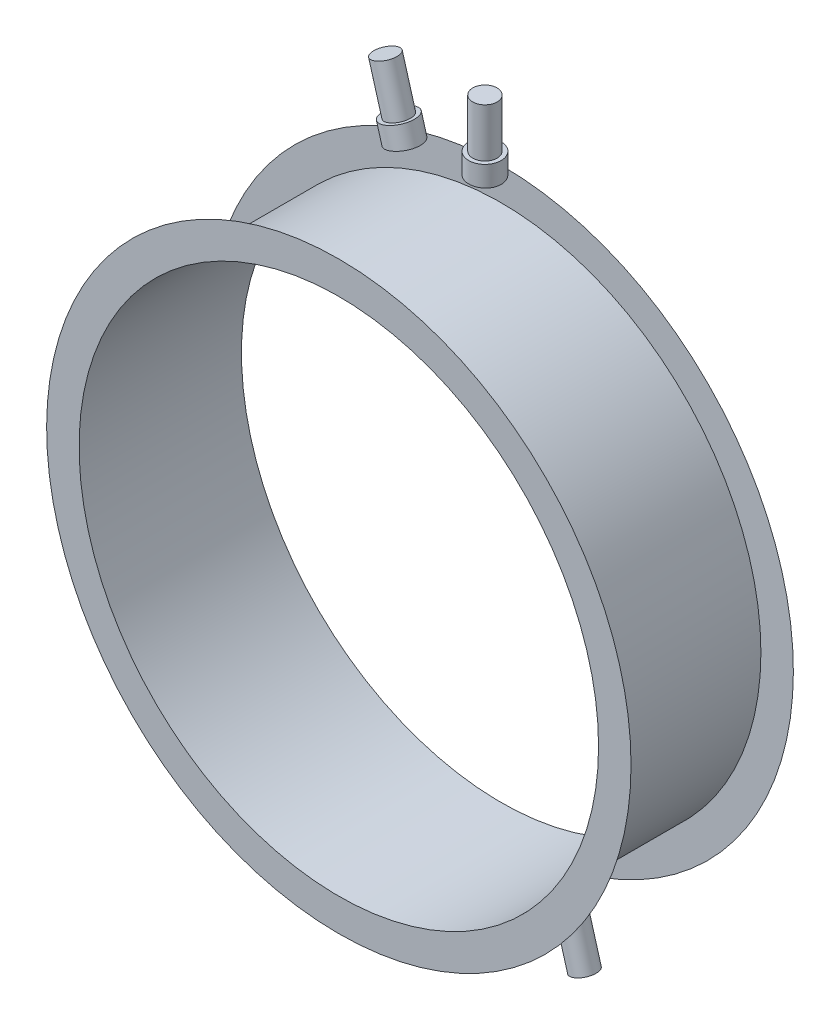
ISO-10303-21;
HEADER;
FILE_DESCRIPTION(('STEP AP214'),'2;1');
FILE_NAME('part.step','',(''),(''),'','','');
FILE_SCHEMA(('AUTOMOTIVE_DESIGN { 1 0 10303 214 1 1 1 1 }'));
ENDSEC;
DATA;
#1=APPLICATION_CONTEXT('core data for automotive mechanical design processes');
#2=APPLICATION_PROTOCOL_DEFINITION('international standard','automotive_design',2000,#1);
#3=PRODUCT_CONTEXT('',#1,'mechanical');
#4=PRODUCT('Part','Part','',(#3));
#5=PRODUCT_RELATED_PRODUCT_CATEGORY('part','',(#4));
#6=PRODUCT_DEFINITION_FORMATION('','',#4);
#7=PRODUCT_DEFINITION_CONTEXT('part definition',#1,'design');
#8=PRODUCT_DEFINITION('design','',#6,#7);
#9=PRODUCT_DEFINITION_SHAPE('','',#8);
#10=(LENGTH_UNIT() NAMED_UNIT(*) SI_UNIT(.MILLI.,.METRE.));
#11=(NAMED_UNIT(*) PLANE_ANGLE_UNIT() SI_UNIT($,.RADIAN.));
#12=(NAMED_UNIT(*) SI_UNIT($,.STERADIAN.) SOLID_ANGLE_UNIT());
#13=UNCERTAINTY_MEASURE_WITH_UNIT(LENGTH_MEASURE(1.E-05),#10,'distance_accuracy_value','');
#14=(GEOMETRIC_REPRESENTATION_CONTEXT(3) GLOBAL_UNCERTAINTY_ASSIGNED_CONTEXT((#13)) GLOBAL_UNIT_ASSIGNED_CONTEXT((#10,
#11,#12)) REPRESENTATION_CONTEXT('',''));
#15=CARTESIAN_POINT('',(0.,0.,0.));
#16=DIRECTION('',(0.,0.,1.));
#17=DIRECTION('',(1.,0.,0.));
#18=AXIS2_PLACEMENT_3D('',#15,#16,#17);
#19=CARTESIAN_POINT('',(0.,0.,10.));
#20=DIRECTION('',(0.,0.,1.));
#21=DIRECTION('',(1.,0.,0.));
#22=AXIS2_PLACEMENT_3D('',#19,#20,#21);
#23=PLANE('',#22);
#24=CARTESIAN_POINT('',(0.,0.,10.));
#25=DIRECTION('',(0.,0.,1.));
#26=DIRECTION('',(1.,0.,0.));
#27=AXIS2_PLACEMENT_3D('',#24,#25,#26);
#28=CIRCLE('',#27,36.);
#29=CARTESIAN_POINT('',(36.,0.,10.));
#30=VERTEX_POINT('',#29);
#31=EDGE_CURVE('E11',#30,#30,#28,.T.);
#32=ORIENTED_EDGE('',*,*,#31,.T.);
#33=EDGE_LOOP('',(#32));
#34=FACE_BOUND('',#33,.T.);
#35=CARTESIAN_POINT('',(0.,0.,10.));
#36=DIRECTION('',(0.,0.,1.));
#37=DIRECTION('',(1.,0.,0.));
#38=AXIS2_PLACEMENT_3D('',#35,#36,#37);
#39=CIRCLE('',#38,32.);
#40=CARTESIAN_POINT('',(32.,0.,10.));
#41=VERTEX_POINT('',#40);
#42=EDGE_CURVE('E76',#41,#41,#39,.T.);
#43=ORIENTED_EDGE('',*,*,#42,.F.);
#44=EDGE_LOOP('',(#43));
#45=FACE_BOUND('',#44,.T.);
#46=ADVANCED_FACE('F39',(#34,#45),#23,.T.);
#47=CARTESIAN_POINT('',(0.,0.,-10.));
#48=DIRECTION('',(0.,0.,1.));
#49=DIRECTION('',(1.,0.,0.));
#50=AXIS2_PLACEMENT_3D('',#47,#48,#49);
#51=PLANE('',#50);
#52=CARTESIAN_POINT('',(0.,0.,-10.));
#53=DIRECTION('',(0.,0.,1.));
#54=DIRECTION('',(1.,0.,0.));
#55=AXIS2_PLACEMENT_3D('',#52,#53,#54);
#56=CIRCLE('',#55,36.);
#57=CARTESIAN_POINT('',(9.92294480941199,-34.6054210537795,-9.99999999999999));
#58=VERTEX_POINT('',#57);
#59=CARTESIAN_POINT('',(0.,36.,-9.99999999999999));
#60=VERTEX_POINT('',#59);
#61=EDGE_CURVE('E67',#58,#60,#56,.T.);
#62=ORIENTED_EDGE('',*,*,#61,.F.);
#63=CARTESIAN_POINT('',(0.,-36.,-9.99999999999999));
#64=VERTEX_POINT('',#63);
#65=EDGE_CURVE('E75',#64,#58,#56,.T.);
#66=ORIENTED_EDGE('',*,*,#65,.F.);
#67=CARTESIAN_POINT('',(-9.92294480941199,34.6054210537795,-9.99999999999999));
#68=VERTEX_POINT('',#67);
#69=EDGE_CURVE('E331',#68,#64,#56,.T.);
#70=ORIENTED_EDGE('',*,*,#69,.F.);
#71=EDGE_CURVE('E44',#60,#68,#56,.T.);
#72=ORIENTED_EDGE('',*,*,#71,.F.);
#73=EDGE_LOOP('',(#62,#66,#70,#72));
#74=FACE_BOUND('',#73,.T.);
#75=CARTESIAN_POINT('',(0.,0.,-10.));
#76=DIRECTION('',(0.,0.,1.));
#77=DIRECTION('',(1.,0.,0.));
#78=AXIS2_PLACEMENT_3D('',#75,#76,#77);
#79=CIRCLE('',#78,32.);
#80=CARTESIAN_POINT('',(32.,0.,-10.));
#81=VERTEX_POINT('',#80);
#82=EDGE_CURVE('E79',#81,#81,#79,.T.);
#83=ORIENTED_EDGE('',*,*,#82,.T.);
#84=EDGE_LOOP('',(#83));
#85=FACE_BOUND('',#84,.T.);
#86=ADVANCED_FACE('F105',(#74,#85),#51,.F.);
#87=CARTESIAN_POINT('',(0.,0.,10.));
#88=DIRECTION('',(0.,0.,-1.));
#89=DIRECTION('',(-1.,0.,0.));
#90=AXIS2_PLACEMENT_3D('',#87,#88,#89);
#91=CYLINDRICAL_SURFACE('',#90,36.);
#92=ORIENTED_EDGE('',*,*,#31,.F.);
#93=EDGE_LOOP('',(#92));
#94=FACE_BOUND('',#93,.T.);
#95=ORIENTED_EDGE('',*,*,#65,.T.);
#96=CARTESIAN_POINT('',(9.92294480941199,-34.6054210537795,-6.));
#97=CARTESIAN_POINT('',(10.0308442928042,-34.5744806036036,-6.00000494774937));
#98=CARTESIAN_POINT('',(10.1386740463086,-34.5430097046028,-6.00948145201388));
#99=CARTESIAN_POINT('',(10.3510772403165,-34.47995815608,-6.04715003511845));
#100=CARTESIAN_POINT('',(10.4556467129515,-34.4483774211239,-6.07536405347581));
#101=CARTESIAN_POINT('',(10.6584613513229,-34.3861665277643,-6.14969629591076));
#102=CARTESIAN_POINT('',(10.7567097567415,-34.3555358866544,-6.19580526184132));
#103=CARTESIAN_POINT('',(10.9441811196667,-34.2962764358472,-6.30460397861821));
#104=CARTESIAN_POINT('',(11.0334061745006,-34.2676471614456,-6.36728986413462));
#105=CARTESIAN_POINT('',(11.2005004547353,-34.2133969021549,-6.50754702106661));
#106=CARTESIAN_POINT('',(11.2783574741308,-34.1877791564493,-6.5851340881755));
#107=CARTESIAN_POINT('',(11.4204761546084,-34.140567464197,-6.75295914014094));
#108=CARTESIAN_POINT('',(11.4847372550701,-34.1189736835807,-6.84319764641785));
#109=CARTESIAN_POINT('',(11.5979457182922,-34.0806578899849,-7.03383293604228));
#110=CARTESIAN_POINT('',(11.6468833783674,-34.0639389641853,-7.13423610255261));
#111=CARTESIAN_POINT('',(11.7280540488071,-34.0360779248755,-7.34230578984241));
#112=CARTESIAN_POINT('',(11.7602872079493,-34.0249357616961,-7.4499722459222));
#113=CARTESIAN_POINT('',(11.807144117694,-34.0087043048033,-7.66939330429886));
#114=CARTESIAN_POINT('',(11.8217861869566,-34.003608714498,-7.78114352870289));
#115=CARTESIAN_POINT('',(11.8331218960797,-33.9996656449351,-8.00565929847598));
#116=CARTESIAN_POINT('',(11.8298157032699,-34.0008181074277,-8.11842483436963));
#117=CARTESIAN_POINT('',(11.8053593729656,-34.0093171602239,-8.34163860572427));
#118=CARTESIAN_POINT('',(11.7842290224478,-34.0166568819136,-8.45208927168562));
#119=CARTESIAN_POINT('',(11.7247262461332,-34.037211650285,-8.66767126323091));
#120=CARTESIAN_POINT('',(11.6863537347541,-34.0504267261294,-8.77280256240897));
#121=CARTESIAN_POINT('',(11.5933839381233,-34.0821925826076,-8.97482883170864));
#122=CARTESIAN_POINT('',(11.5387776074371,-34.1007463377516,-9.07171917118094));
#123=CARTESIAN_POINT('',(11.4148321000376,-34.1424350169363,-9.25446252398772));
#124=CARTESIAN_POINT('',(11.3454927936229,-34.1655699813074,-9.34031544014386));
#125=CARTESIAN_POINT('',(11.1938650179452,-34.2155483878182,-9.49866860225165));
#126=CARTESIAN_POINT('',(11.1115591410339,-34.242396809281,-9.57115060958609));
#127=CARTESIAN_POINT('',(10.9363220122398,-34.2987655434049,-9.70056385615663));
#128=CARTESIAN_POINT('',(10.8433907573213,-34.3282858568293,-9.7574950909497));
#129=CARTESIAN_POINT('',(10.6494663075781,-34.3889397506332,-9.85418906154846));
#130=CARTESIAN_POINT('',(10.5484728034218,-34.4200733928967,-9.89395113823401));
#131=CARTESIAN_POINT('',(10.341246653076,-34.4828991194009,-9.95516606300324));
#132=CARTESIAN_POINT('',(10.2350140552739,-34.5145911984824,-9.97661908015255));
#133=CARTESIAN_POINT('',(10.0204496538186,-34.5774936590455,-10.0005843842558));
#134=CARTESIAN_POINT('',(9.9121208388112,-34.6087046265902,-10.0031218940885));
#135=CARTESIAN_POINT('',(9.69630299733218,-34.6697892561597,-9.98925000975776));
#136=CARTESIAN_POINT('',(9.5888139674215,-34.6996629236633,-9.97284069322512));
#137=CARTESIAN_POINT('',(9.37781641334908,-34.7572800841819,-9.92156183606236));
#138=CARTESIAN_POINT('',(9.27430544421754,-34.7850248964195,-9.88670383535764));
#139=CARTESIAN_POINT('',(9.07416506366588,-34.837770436893,-9.79952880805727));
#140=CARTESIAN_POINT('',(8.9775357011999,-34.8627711456085,-9.74721165727631));
#141=CARTESIAN_POINT('',(8.79384962330079,-34.9095576365602,-9.62653899778058));
#142=CARTESIAN_POINT('',(8.70680312668272,-34.931339995171,-9.55816660708031));
#143=CARTESIAN_POINT('',(8.54492915756452,-34.9712903788076,-9.40734893524557));
#144=CARTESIAN_POINT('',(8.47010178089174,-34.9894583754883,-9.32490354375522));
#145=CARTESIAN_POINT('',(8.33478065844946,-35.0219401695929,-9.14817155362391));
#146=CARTESIAN_POINT('',(8.27430269274154,-35.0362497262234,-9.05387209172408));
#147=CARTESIAN_POINT('',(8.16957349417223,-35.0608182293198,-8.85617362336364));
#148=CARTESIAN_POINT('',(8.12532217835486,-35.0710771964936,-8.75277466342602));
#149=CARTESIAN_POINT('',(8.05438458521675,-35.0874368202269,-8.53987248743101));
#150=CARTESIAN_POINT('',(8.02768821559195,-35.0935398660892,-8.43037281800779));
#151=CARTESIAN_POINT('',(7.99262010167114,-35.1015434477758,-8.20832804070095));
#152=CARTESIAN_POINT('',(7.98424822094657,-35.1034440148881,-8.09578295549722));
#153=CARTESIAN_POINT('',(7.98607922919169,-35.1030274897863,-7.87100462753937));
#154=CARTESIAN_POINT('',(7.99625702285902,-35.1007160958096,-7.75877116889688));
#155=CARTESIAN_POINT('',(8.03483294920206,-35.0919056982572,-7.53764994837896));
#156=CARTESIAN_POINT('',(8.06323111594376,-35.0854066868521,-7.42876219275928));
#157=CARTESIAN_POINT('',(8.1373995606435,-35.068278645287,-7.2174186203501));
#158=CARTESIAN_POINT('',(8.18316987334507,-35.0576496068671,-7.11496281642471));
#159=CARTESIAN_POINT('',(8.29072378116876,-35.0323698529778,-6.91938164346649));
#160=CARTESIAN_POINT('',(8.35250691694994,-35.0177192528695,-6.82625600689642));
#161=CARTESIAN_POINT('',(8.49035543944084,-34.9845520503984,-6.65184929180712));
#162=CARTESIAN_POINT('',(8.56643845372571,-34.9660306733093,-6.57058305448308));
#163=CARTESIAN_POINT('',(8.730634883088,-34.9253940794714,-6.42231224092881));
#164=CARTESIAN_POINT('',(8.81875124636567,-34.9032779817538,-6.35531117002627));
#165=CARTESIAN_POINT('',(9.00452470328028,-34.8558134287587,-6.23743381605326));
#166=CARTESIAN_POINT('',(9.10219193993938,-34.8304615281487,-6.18657492466679));
#167=CARTESIAN_POINT('',(9.30408746343392,-34.7770731116726,-6.1025764799383));
#168=CARTESIAN_POINT('',(9.40830786546258,-34.7490398016906,-6.06941607103533));
#169=CARTESIAN_POINT('',(9.58146516345472,-34.7015908767497,-6.0304208682908));
#170=CARTESIAN_POINT('',(9.64936491340026,-34.6827735013672,-6.0190276847576));
#171=CARTESIAN_POINT('',(9.78583409166316,-34.6445157838326,-6.00381568317647));
#172=CARTESIAN_POINT('',(9.85440351926418,-34.6250754423468,-5.99999685702735));
#173=CARTESIAN_POINT('',(9.92294480941199,-34.6054210537795,-6.));
#174=B_SPLINE_CURVE_WITH_KNOTS('',3,(#96,#97,#98,#99,#100,#101,#102,#103,#104,#105,#106,#107,
#108,#109,#110,#111,#112,#113,#114,#115,#116,#117,#118,#119,#120,#121,#122,#123,#124,#125,#126,
#127,#128,#129,#130,#131,#132,#133,#134,#135,#136,#137,#138,#139,#140,#141,#142,#143,#144,#145,
#146,#147,#148,#149,#150,#151,#152,#153,#154,#155,#156,#157,#158,#159,#160,#161,#162,#163,#164,
#165,#166,#167,#168,#169,#170,#171,#172,#173),.UNSPECIFIED.,.T.,.F.,(4,2,2,2,2,2,2,2,2,2,2,2,2,
2,2,2,2,2,2,2,2,2,2,2,2,2,2,2,2,2,2,2,2,2,2,2,2,2,4),(0.,0.336483661551826,0.673362003810658,
1.01006629020865,1.3466921345705,1.68367680166852,2.02067536144232,2.35788687663007,
2.69509538841295,3.03195243946604,3.36880635004592,3.70528680331766,4.04176892674822,
4.37843888951809,4.71511181627549,5.05224064045979,5.38936956096526,5.726511422624,
6.06365017108532,6.40033928140958,6.73702701222399,7.07350438834911,7.40998415785734,
7.74681933070585,8.08365714502737,8.42086368095268,8.75806849294323,9.09507927667147,
9.43208755129533,9.76864023584188,10.1051935496308,10.441747536515,10.778291870141,
11.1152538184311,11.4522984718413,11.7897050361652,12.1267131241279,12.3404588087093,
12.5542042646777),.UNSPECIFIED.);
#175=EDGE_CURVE('E53',#58,#58,#174,.T.);
#176=ORIENTED_EDGE('',*,*,#175,.T.);
#177=ORIENTED_EDGE('',*,*,#61,.T.);
#178=CARTESIAN_POINT('',(0.,36.,-9.99999999999999));
#179=CARTESIAN_POINT('',(0.112247984270715,35.9999992586871,-9.99999505225063));
#180=CARTESIAN_POINT('',(0.224575151382698,35.9994693970752,-9.99051854798611));
#181=CARTESIAN_POINT('',(0.446129567992539,35.9974066133741,-9.95284996488155));
#182=CARTESIAN_POINT('',(0.555353026879048,35.9958725154675,-9.92463594652418));
#183=CARTESIAN_POINT('',(0.767458616269681,35.9919748572525,-9.85030370408923));
#184=CARTESIAN_POINT('',(0.87034399400812,35.9896117259143,-9.80419473815868));
#185=CARTESIAN_POINT('',(1.06688715260117,35.9843219964991,-9.69539602138179));
#186=CARTESIAN_POINT('',(1.16054707762597,35.9813955298214,-9.63271013586538));
#187=CARTESIAN_POINT('',(1.33612180684931,35.9753042591466,-9.49245297893338));
#188=CARTESIAN_POINT('',(1.41802398504239,35.9721392044215,-9.4148659118245));
#189=CARTESIAN_POINT('',(1.56765053487886,35.965929630358,-9.24704085985906));
#190=CARTESIAN_POINT('',(1.63537432188265,35.9628851159941,-9.15680235358214));
#191=CARTESIAN_POINT('',(1.75475854526694,35.9572580927197,-8.96616706395772));
#192=CARTESIAN_POINT('',(1.80640880388556,35.9546758769743,-8.86576389744739));
#193=CARTESIAN_POINT('',(1.89211460341859,35.9502677960466,-8.65769421015759));
#194=CARTESIAN_POINT('',(1.92617030103785,35.948441924128,-8.5500277540778));
#195=CARTESIAN_POINT('',(1.97568604942447,35.9457547610515,-8.33060669570114));
#196=CARTESIAN_POINT('',(1.99116544479396,35.944892466528,-8.21885647129711));
#197=CARTESIAN_POINT('',(2.00314888503847,35.9442266896818,-7.99434070152402));
#198=CARTESIAN_POINT('',(1.99965310681681,35.944423197488,-7.88157516563037));
#199=CARTESIAN_POINT('',(1.97380151683238,35.9458519331747,-7.65836139427573));
#200=CARTESIAN_POINT('',(1.95146661877886,35.9470830125496,-7.54791072831438));
#201=CARTESIAN_POINT('',(1.88860321710239,35.9504403361268,-7.33232873676909));
#202=CARTESIAN_POINT('',(1.84807462317397,35.9525665847723,-7.22719743759102));
#203=CARTESIAN_POINT('',(1.74995046210876,35.9574759369293,-7.02517116829136));
#204=CARTESIAN_POINT('',(1.692345380056,35.9602594064639,-6.92828082881906));
#205=CARTESIAN_POINT('',(1.56171035411121,35.9661691249933,-6.74553747601228));
#206=CARTESIAN_POINT('',(1.48868027442568,35.9692953770058,-6.65968455985613));
#207=CARTESIAN_POINT('',(1.32915038580785,35.9755434256525,-6.50133139774835));
#208=CARTESIAN_POINT('',(1.24263247108248,35.9786652105211,-6.42884939041391));
#209=CARTESIAN_POINT('',(1.05864640264184,35.9845484166612,-6.29943614384337));
#210=CARTESIAN_POINT('',(0.961178245797988,35.9873098378297,-6.2425049090503));
#211=CARTESIAN_POINT('',(0.758047621445824,35.9921612800974,-6.14581093845154));
#212=CARTESIAN_POINT('',(0.652384839531349,35.99425127542,-6.10604886176599));
#213=CARTESIAN_POINT('',(0.435869161676293,35.9975239716906,-6.04483393699676));
#214=CARTESIAN_POINT('',(0.325016313670688,35.9987066810165,-6.02338091984745));
#215=CARTESIAN_POINT('',(0.1014255053358,36.0000304426664,-5.99941561574417));
#216=CARTESIAN_POINT('',(-0.0113097436637004,36.000172882133,-5.99687810591151));
#217=CARTESIAN_POINT('',(-0.235604373753162,35.9994037375853,-6.01074999024224));
#218=CARTESIAN_POINT('',(-0.347163759659092,35.9984921578897,-6.02715930677488));
#219=CARTESIAN_POINT('',(-0.565869068100618,35.9957185194366,-6.07843816393764));
#220=CARTESIAN_POINT('',(-0.673017704519049,35.9938570548722,-6.11329616464236));
#221=CARTESIAN_POINT('',(-0.879943627461122,35.9893931572734,-6.20047119194273));
#222=CARTESIAN_POINT('',(-0.979720861546504,35.9867907189686,-6.25278834272369));
#223=CARTESIAN_POINT('',(-1.16918735696194,35.9811340357953,-6.37346100221942));
#224=CARTESIAN_POINT('',(-1.25886585165746,35.9780793166141,-6.44183339291969));
#225=CARTESIAN_POINT('',(-1.42548091584976,35.9718635773187,-6.59265106475443));
#226=CARTESIAN_POINT('',(-1.5024173854184,35.968702556371,-6.67509645624478));
#227=CARTESIAN_POINT('',(-1.64144959291272,35.9626265044828,-6.85182844637609));
#228=CARTESIAN_POINT('',(-1.70352899314856,35.9597117466047,-6.94612790827593));
#229=CARTESIAN_POINT('',(-1.81097315740943,35.9544612281873,-7.14382637663636));
#230=CARTESIAN_POINT('',(-1.85633800688474,35.9521254646881,-7.24722533657399));
#231=CARTESIAN_POINT('',(-1.92903692139846,35.9482982937422,-7.46012751256899));
#232=CARTESIAN_POINT('',(-1.95638134636332,35.946806401225,-7.56962718199221));
#233=CARTESIAN_POINT('',(-1.99229706711735,35.9448338555359,-7.79167195929905));
#234=CARTESIAN_POINT('',(-2.00086850267423,35.9443531948355,-7.90421704450278));
#235=CARTESIAN_POINT('',(-1.99899361470555,35.9444574994808,-8.12899537246063));
#236=CARTESIAN_POINT('',(-1.98857298498,35.9450410251213,-8.24122883110312));
#237=CARTESIAN_POINT('',(-1.94906294991607,35.9472048937636,-8.46235005162104));
#238=CARTESIAN_POINT('',(-1.91997350967327,35.9487852386292,-8.57123780724072));
#239=CARTESIAN_POINT('',(-1.84395709664876,35.9527643023283,-8.7825813796499));
#240=CARTESIAN_POINT('',(-1.79703008819268,35.9551630227986,-8.88503718357529));
#241=CARTESIAN_POINT('',(-1.68667459183555,35.9605084384624,-9.08061835653351));
#242=CARTESIAN_POINT('',(-1.62324657727916,35.9634551179365,-9.17374399310358));
#243=CARTESIAN_POINT('',(-1.48159595277799,35.9695689588823,-9.34815070819289));
#244=CARTESIAN_POINT('',(-1.40335508202749,35.9727363894106,-9.42941694551692));
#245=CARTESIAN_POINT('',(-1.23431838059679,35.9789326579249,-9.57768775907119));
#246=CARTESIAN_POINT('',(-1.14351947309669,35.9819614617033,-9.64468882997373));
#247=CARTESIAN_POINT('',(-0.951859560960019,35.9875417094392,-9.76256618394674));
#248=CARTESIAN_POINT('',(-0.850987856562409,35.9900926373262,-9.81342507533321));
#249=CARTESIAN_POINT('',(-0.642197581296978,35.9944223458083,-9.89742352006169));
#250=CARTESIAN_POINT('',(-0.534287473453295,35.9962020347496,-9.93058392896467));
#251=CARTESIAN_POINT('',(-0.354759299314215,35.9983198204495,-9.9695791317092));
#252=CARTESIAN_POINT('',(-0.284303098933929,35.9989471058118,-9.9809723152424));
#253=CARTESIAN_POINT('',(-0.142575249092794,35.9997874308187,-9.99618431682353));
#254=CARTESIAN_POINT('',(-0.0713036005041932,36.0000004709063,-10.0000031429726));
#255=CARTESIAN_POINT('',(0.,36.,-9.99999999999999));
#256=B_SPLINE_CURVE_WITH_KNOTS('',3,(#178,#179,#180,#181,#182,#183,#184,#185,#186,#187,#188,
#189,#190,#191,#192,#193,#194,#195,#196,#197,#198,#199,#200,#201,#202,#203,#204,#205,#206,#207,
#208,#209,#210,#211,#212,#213,#214,#215,#216,#217,#218,#219,#220,#221,#222,#223,#224,#225,#226,
#227,#228,#229,#230,#231,#232,#233,#234,#235,#236,#237,#238,#239,#240,#241,#242,#243,#244,#245,
#246,#247,#248,#249,#250,#251,#252,#253,#254,#255),.UNSPECIFIED.,.T.,.F.,(4,2,2,2,2,2,2,2,2,2,2,
2,2,2,2,2,2,2,2,2,2,2,2,2,2,2,2,2,2,2,2,2,2,2,2,2,2,2,4),(0.,0.336483661551827,
0.673362003810658,1.01006629020865,1.3466921345705,1.68367680166852,2.02067536144233,
2.35788687663007,2.69509538841295,3.03195243946605,3.36880635004592,3.70528680331766,
4.04176892674822,4.37843888951809,4.71511181627549,5.05224064045979,5.38936956096526,
5.72651142262401,6.06365017108533,6.40033928140958,6.73702701222399,7.07350438834911,
7.40998415785734,7.74681933070585,8.08365714502738,8.42086368095269,8.75806849294323,
9.09507927667147,9.43208755129533,9.76864023584188,10.1051935496308,10.441747536515,
10.778291870141,11.1152538184311,11.4522984718413,11.7897050361652,12.1267131241279,
12.3404588087093,12.5542042646777),.UNSPECIFIED.);
#257=EDGE_CURVE('E71',#60,#60,#256,.T.);
#258=ORIENTED_EDGE('',*,*,#257,.T.);
#259=ORIENTED_EDGE('',*,*,#71,.T.);
#260=CARTESIAN_POINT('',(-9.92294480941199,34.6054210537795,-6.));
#261=CARTESIAN_POINT('',(-10.0308442928042,34.5744806036036,-6.00000494774937));
#262=CARTESIAN_POINT('',(-10.1386740463086,34.5430097046028,-6.00948145201388));
#263=CARTESIAN_POINT('',(-10.3510772403165,34.47995815608,-6.04715003511845));
#264=CARTESIAN_POINT('',(-10.4556467129515,34.4483774211239,-6.07536405347581));
#265=CARTESIAN_POINT('',(-10.6584613513229,34.3861665277643,-6.14969629591076));
#266=CARTESIAN_POINT('',(-10.7567097567415,34.3555358866544,-6.19580526184132));
#267=CARTESIAN_POINT('',(-10.9441811196667,34.2962764358472,-6.30460397861821));
#268=CARTESIAN_POINT('',(-11.0334061745006,34.2676471614456,-6.36728986413462));
#269=CARTESIAN_POINT('',(-11.2005004547353,34.2133969021549,-6.50754702106661));
#270=CARTESIAN_POINT('',(-11.2783574741308,34.1877791564493,-6.5851340881755));
#271=CARTESIAN_POINT('',(-11.4204761546084,34.140567464197,-6.75295914014094));
#272=CARTESIAN_POINT('',(-11.4847372550701,34.1189736835807,-6.84319764641785));
#273=CARTESIAN_POINT('',(-11.5979457182922,34.0806578899849,-7.03383293604228));
#274=CARTESIAN_POINT('',(-11.6468833783674,34.0639389641853,-7.13423610255261));
#275=CARTESIAN_POINT('',(-11.7280540488071,34.0360779248755,-7.34230578984241));
#276=CARTESIAN_POINT('',(-11.7602872079493,34.0249357616961,-7.4499722459222));
#277=CARTESIAN_POINT('',(-11.807144117694,34.0087043048033,-7.66939330429886));
#278=CARTESIAN_POINT('',(-11.8217861869566,34.003608714498,-7.78114352870289));
#279=CARTESIAN_POINT('',(-11.8331218960797,33.9996656449351,-8.00565929847598));
#280=CARTESIAN_POINT('',(-11.8298157032699,34.0008181074277,-8.11842483436963));
#281=CARTESIAN_POINT('',(-11.8053593729656,34.0093171602239,-8.34163860572427));
#282=CARTESIAN_POINT('',(-11.7842290224478,34.0166568819136,-8.45208927168562));
#283=CARTESIAN_POINT('',(-11.7247262461332,34.037211650285,-8.66767126323091));
#284=CARTESIAN_POINT('',(-11.6863537347541,34.0504267261294,-8.77280256240897));
#285=CARTESIAN_POINT('',(-11.5933839381233,34.0821925826076,-8.97482883170864));
#286=CARTESIAN_POINT('',(-11.5387776074371,34.1007463377516,-9.07171917118094));
#287=CARTESIAN_POINT('',(-11.4148321000376,34.1424350169363,-9.25446252398772));
#288=CARTESIAN_POINT('',(-11.3454927936229,34.1655699813074,-9.34031544014386));
#289=CARTESIAN_POINT('',(-11.1938650179452,34.2155483878182,-9.49866860225165));
#290=CARTESIAN_POINT('',(-11.1115591410339,34.242396809281,-9.57115060958609));
#291=CARTESIAN_POINT('',(-10.9363220122398,34.2987655434049,-9.70056385615663));
#292=CARTESIAN_POINT('',(-10.8433907573213,34.3282858568293,-9.7574950909497));
#293=CARTESIAN_POINT('',(-10.6494663075781,34.3889397506332,-9.85418906154846));
#294=CARTESIAN_POINT('',(-10.5484728034218,34.4200733928967,-9.89395113823401));
#295=CARTESIAN_POINT('',(-10.341246653076,34.4828991194009,-9.95516606300324));
#296=CARTESIAN_POINT('',(-10.2350140552739,34.5145911984824,-9.97661908015255));
#297=CARTESIAN_POINT('',(-10.0204496538186,34.5774936590455,-10.0005843842558));
#298=CARTESIAN_POINT('',(-9.9121208388112,34.6087046265902,-10.0031218940885));
#299=CARTESIAN_POINT('',(-9.69630299733218,34.6697892561597,-9.98925000975776));
#300=CARTESIAN_POINT('',(-9.5888139674215,34.6996629236633,-9.97284069322512));
#301=CARTESIAN_POINT('',(-9.37781641334908,34.7572800841819,-9.92156183606236));
#302=CARTESIAN_POINT('',(-9.27430544421754,34.7850248964195,-9.88670383535764));
#303=CARTESIAN_POINT('',(-9.07416506366588,34.837770436893,-9.79952880805727));
#304=CARTESIAN_POINT('',(-8.9775357011999,34.8627711456085,-9.74721165727631));
#305=CARTESIAN_POINT('',(-8.79384962330079,34.9095576365602,-9.62653899778058));
#306=CARTESIAN_POINT('',(-8.70680312668272,34.931339995171,-9.55816660708031));
#307=CARTESIAN_POINT('',(-8.54492915756452,34.9712903788076,-9.40734893524557));
#308=CARTESIAN_POINT('',(-8.47010178089174,34.9894583754883,-9.32490354375522));
#309=CARTESIAN_POINT('',(-8.33478065844946,35.0219401695929,-9.14817155362391));
#310=CARTESIAN_POINT('',(-8.27430269274154,35.0362497262234,-9.05387209172408));
#311=CARTESIAN_POINT('',(-8.16957349417223,35.0608182293198,-8.85617362336364));
#312=CARTESIAN_POINT('',(-8.12532217835486,35.0710771964936,-8.75277466342602));
#313=CARTESIAN_POINT('',(-8.05438458521675,35.0874368202269,-8.53987248743101));
#314=CARTESIAN_POINT('',(-8.02768821559195,35.0935398660892,-8.43037281800779));
#315=CARTESIAN_POINT('',(-7.99262010167114,35.1015434477758,-8.20832804070095));
#316=CARTESIAN_POINT('',(-7.98424822094657,35.1034440148881,-8.09578295549722));
#317=CARTESIAN_POINT('',(-7.98607922919169,35.1030274897863,-7.87100462753937));
#318=CARTESIAN_POINT('',(-7.99625702285902,35.1007160958096,-7.75877116889688));
#319=CARTESIAN_POINT('',(-8.03483294920206,35.0919056982572,-7.53764994837896));
#320=CARTESIAN_POINT('',(-8.06323111594376,35.0854066868521,-7.42876219275928));
#321=CARTESIAN_POINT('',(-8.1373995606435,35.068278645287,-7.2174186203501));
#322=CARTESIAN_POINT('',(-8.18316987334507,35.0576496068671,-7.11496281642471));
#323=CARTESIAN_POINT('',(-8.29072378116876,35.0323698529778,-6.91938164346649));
#324=CARTESIAN_POINT('',(-8.35250691694994,35.0177192528695,-6.82625600689642));
#325=CARTESIAN_POINT('',(-8.49035543944084,34.9845520503984,-6.65184929180712));
#326=CARTESIAN_POINT('',(-8.56643845372571,34.9660306733093,-6.57058305448308));
#327=CARTESIAN_POINT('',(-8.730634883088,34.9253940794714,-6.42231224092881));
#328=CARTESIAN_POINT('',(-8.81875124636567,34.9032779817538,-6.35531117002627));
#329=CARTESIAN_POINT('',(-9.00452470328028,34.8558134287587,-6.23743381605326));
#330=CARTESIAN_POINT('',(-9.10219193993938,34.8304615281487,-6.18657492466679));
#331=CARTESIAN_POINT('',(-9.30408746343392,34.7770731116726,-6.1025764799383));
#332=CARTESIAN_POINT('',(-9.40830786546258,34.7490398016906,-6.06941607103533));
#333=CARTESIAN_POINT('',(-9.58146516345472,34.7015908767497,-6.0304208682908));
#334=CARTESIAN_POINT('',(-9.64936491340026,34.6827735013672,-6.0190276847576));
#335=CARTESIAN_POINT('',(-9.78583409166316,34.6445157838326,-6.00381568317647));
#336=CARTESIAN_POINT('',(-9.85440351926418,34.6250754423468,-5.99999685702735));
#337=CARTESIAN_POINT('',(-9.92294480941199,34.6054210537795,-6.));
#338=B_SPLINE_CURVE_WITH_KNOTS('',3,(#260,#261,#262,#263,#264,#265,#266,#267,#268,#269,#270,
#271,#272,#273,#274,#275,#276,#277,#278,#279,#280,#281,#282,#283,#284,#285,#286,#287,#288,#289,
#290,#291,#292,#293,#294,#295,#296,#297,#298,#299,#300,#301,#302,#303,#304,#305,#306,#307,#308,
#309,#310,#311,#312,#313,#314,#315,#316,#317,#318,#319,#320,#321,#322,#323,#324,#325,#326,#327,
#328,#329,#330,#331,#332,#333,#334,#335,#336,#337),.UNSPECIFIED.,.T.,.F.,(4,2,2,2,2,2,2,2,2,2,2,
2,2,2,2,2,2,2,2,2,2,2,2,2,2,2,2,2,2,2,2,2,2,2,2,2,2,2,4),(0.,0.336483661551826,
0.673362003810658,1.01006629020865,1.3466921345705,1.68367680166852,2.02067536144232,
2.35788687663007,2.69509538841295,3.03195243946604,3.36880635004592,3.70528680331766,
4.04176892674822,4.37843888951809,4.71511181627549,5.05224064045979,5.38936956096526,
5.726511422624,6.06365017108532,6.40033928140958,6.73702701222399,7.07350438834911,
7.40998415785734,7.74681933070585,8.08365714502737,8.42086368095268,8.75806849294323,
9.09507927667147,9.43208755129533,9.76864023584188,10.1051935496308,10.441747536515,
10.778291870141,11.1152538184311,11.4522984718413,11.7897050361652,12.1267131241279,
12.3404588087093,12.5542042646777),.UNSPECIFIED.);
#339=EDGE_CURVE('E300',#68,#68,#338,.T.);
#340=ORIENTED_EDGE('',*,*,#339,.T.);
#341=ORIENTED_EDGE('',*,*,#69,.T.);
#342=CARTESIAN_POINT('',(0.,-36.,-6.));
#343=CARTESIAN_POINT('',(0.112247984270715,-35.9999992586871,-6.00000494774937));
#344=CARTESIAN_POINT('',(0.224575151382697,-35.9994693970752,-6.00948145201388));
#345=CARTESIAN_POINT('',(0.446129567992538,-35.9974066133741,-6.04715003511845));
#346=CARTESIAN_POINT('',(0.555353026879048,-35.9958725154675,-6.07536405347581));
#347=CARTESIAN_POINT('',(0.767458616269681,-35.9919748572525,-6.14969629591076));
#348=CARTESIAN_POINT('',(0.87034399400812,-35.9896117259143,-6.19580526184132));
#349=CARTESIAN_POINT('',(1.06688715260117,-35.9843219964991,-6.30460397861821));
#350=CARTESIAN_POINT('',(1.16054707762597,-35.9813955298214,-6.36728986413462));
#351=CARTESIAN_POINT('',(1.33612180684931,-35.9753042591466,-6.50754702106662));
#352=CARTESIAN_POINT('',(1.41802398504239,-35.9721392044215,-6.5851340881755));
#353=CARTESIAN_POINT('',(1.56765053487886,-35.965929630358,-6.75295914014094));
#354=CARTESIAN_POINT('',(1.63537432188266,-35.9628851159941,-6.84319764641786));
#355=CARTESIAN_POINT('',(1.75475854526694,-35.9572580927197,-7.03383293604228));
#356=CARTESIAN_POINT('',(1.80640880388556,-35.9546758769743,-7.1342361025526));
#357=CARTESIAN_POINT('',(1.89211460341859,-35.9502677960466,-7.34230578984241));
#358=CARTESIAN_POINT('',(1.92617030103785,-35.948441924128,-7.4499722459222));
#359=CARTESIAN_POINT('',(1.97568604942447,-35.9457547610515,-7.66939330429886));
#360=CARTESIAN_POINT('',(1.99116544479395,-35.944892466528,-7.78114352870289));
#361=CARTESIAN_POINT('',(2.00314888503847,-35.9442266896818,-8.00565929847598));
#362=CARTESIAN_POINT('',(1.99965310681681,-35.944423197488,-8.11842483436963));
#363=CARTESIAN_POINT('',(1.97380151683238,-35.9458519331747,-8.34163860572427));
#364=CARTESIAN_POINT('',(1.95146661877886,-35.9470830125496,-8.45208927168562));
#365=CARTESIAN_POINT('',(1.88860321710239,-35.9504403361268,-8.66767126323091));
#366=CARTESIAN_POINT('',(1.84807462317397,-35.9525665847723,-8.77280256240897));
#367=CARTESIAN_POINT('',(1.74995046210876,-35.9574759369293,-8.97482883170864));
#368=CARTESIAN_POINT('',(1.692345380056,-35.9602594064639,-9.07171917118094));
#369=CARTESIAN_POINT('',(1.56171035411121,-35.9661691249933,-9.25446252398772));
#370=CARTESIAN_POINT('',(1.48868027442568,-35.9692953770058,-9.34031544014387));
#371=CARTESIAN_POINT('',(1.32915038580785,-35.9755434256525,-9.49866860225165));
#372=CARTESIAN_POINT('',(1.24263247108248,-35.9786652105211,-9.57115060958609));
#373=CARTESIAN_POINT('',(1.05864640264184,-35.9845484166612,-9.70056385615663));
#374=CARTESIAN_POINT('',(0.961178245797988,-35.9873098378297,-9.7574950909497));
#375=CARTESIAN_POINT('',(0.758047621445824,-35.9921612800974,-9.85418906154846));
#376=CARTESIAN_POINT('',(0.652384839531349,-35.99425127542,-9.89395113823401));
#377=CARTESIAN_POINT('',(0.435869161676293,-35.9975239716906,-9.95516606300324));
#378=CARTESIAN_POINT('',(0.325016313670689,-35.9987066810165,-9.97661908015255));
#379=CARTESIAN_POINT('',(0.1014255053358,-36.0000304426664,-10.0005843842558));
#380=CARTESIAN_POINT('',(-0.0113097436637002,-36.000172882133,-10.0031218940885));
#381=CARTESIAN_POINT('',(-0.235604373753162,-35.9994037375853,-9.98925000975776));
#382=CARTESIAN_POINT('',(-0.347163759659092,-35.9984921578897,-9.97284069322512));
#383=CARTESIAN_POINT('',(-0.565869068100619,-35.9957185194366,-9.92156183606236));
#384=CARTESIAN_POINT('',(-0.67301770451905,-35.9938570548722,-9.88670383535764));
#385=CARTESIAN_POINT('',(-0.879943627461123,-35.9893931572734,-9.79952880805727));
#386=CARTESIAN_POINT('',(-0.979720861546504,-35.9867907189686,-9.74721165727631));
#387=CARTESIAN_POINT('',(-1.16918735696194,-35.9811340357953,-9.62653899778058));
#388=CARTESIAN_POINT('',(-1.25886585165746,-35.9780793166141,-9.55816660708031));
#389=CARTESIAN_POINT('',(-1.42548091584976,-35.9718635773187,-9.40734893524557));
#390=CARTESIAN_POINT('',(-1.5024173854184,-35.968702556371,-9.32490354375522));
#391=CARTESIAN_POINT('',(-1.64144959291272,-35.9626265044828,-9.14817155362391));
#392=CARTESIAN_POINT('',(-1.70352899314856,-35.9597117466047,-9.05387209172407));
#393=CARTESIAN_POINT('',(-1.81097315740943,-35.9544612281873,-8.85617362336364));
#394=CARTESIAN_POINT('',(-1.85633800688474,-35.9521254646881,-8.75277466342601));
#395=CARTESIAN_POINT('',(-1.92903692139846,-35.9482982937422,-8.53987248743101));
#396=CARTESIAN_POINT('',(-1.95638134636332,-35.946806401225,-8.43037281800779));
#397=CARTESIAN_POINT('',(-1.99229706711735,-35.9448338555359,-8.20832804070095));
#398=CARTESIAN_POINT('',(-2.00086850267423,-35.9443531948355,-8.09578295549722));
#399=CARTESIAN_POINT('',(-1.99899361470555,-35.9444574994808,-7.87100462753937));
#400=CARTESIAN_POINT('',(-1.98857298498,-35.9450410251213,-7.75877116889688));
#401=CARTESIAN_POINT('',(-1.94906294991607,-35.9472048937636,-7.53764994837896));
#402=CARTESIAN_POINT('',(-1.91997350967327,-35.9487852386292,-7.42876219275928));
#403=CARTESIAN_POINT('',(-1.84395709664876,-35.9527643023283,-7.2174186203501));
#404=CARTESIAN_POINT('',(-1.79703008819269,-35.9551630227986,-7.11496281642471));
#405=CARTESIAN_POINT('',(-1.68667459183555,-35.9605084384624,-6.91938164346649));
#406=CARTESIAN_POINT('',(-1.62324657727916,-35.9634551179365,-6.82625600689642));
#407=CARTESIAN_POINT('',(-1.48159595277799,-35.9695689588823,-6.65184929180711));
#408=CARTESIAN_POINT('',(-1.40335508202749,-35.9727363894106,-6.57058305448308));
#409=CARTESIAN_POINT('',(-1.23431838059679,-35.9789326579249,-6.42231224092881));
#410=CARTESIAN_POINT('',(-1.14351947309669,-35.9819614617033,-6.35531117002627));
#411=CARTESIAN_POINT('',(-0.951859560960019,-35.9875417094392,-6.23743381605326));
#412=CARTESIAN_POINT('',(-0.850987856562409,-35.9900926373262,-6.18657492466679));
#413=CARTESIAN_POINT('',(-0.642197581296978,-35.9944223458083,-6.1025764799383));
#414=CARTESIAN_POINT('',(-0.534287473453295,-35.9962020347496,-6.06941607103533));
#415=CARTESIAN_POINT('',(-0.354759299314214,-35.9983198204495,-6.0304208682908));
#416=CARTESIAN_POINT('',(-0.284303098933928,-35.9989471058118,-6.0190276847576));
#417=CARTESIAN_POINT('',(-0.142575249092793,-35.9997874308187,-6.00381568317647));
#418=CARTESIAN_POINT('',(-0.0713036005041924,-36.0000004709063,-5.99999685702735));
#419=CARTESIAN_POINT('',(0.,-36.,-6.));
#420=B_SPLINE_CURVE_WITH_KNOTS('',3,(#342,#343,#344,#345,#346,#347,#348,#349,#350,#351,#352,
#353,#354,#355,#356,#357,#358,#359,#360,#361,#362,#363,#364,#365,#366,#367,#368,#369,#370,#371,
#372,#373,#374,#375,#376,#377,#378,#379,#380,#381,#382,#383,#384,#385,#386,#387,#388,#389,#390,
#391,#392,#393,#394,#395,#396,#397,#398,#399,#400,#401,#402,#403,#404,#405,#406,#407,#408,#409,
#410,#411,#412,#413,#414,#415,#416,#417,#418,#419),.UNSPECIFIED.,.T.,.F.,(4,2,2,2,2,2,2,2,2,2,2,
2,2,2,2,2,2,2,2,2,2,2,2,2,2,2,2,2,2,2,2,2,2,2,2,2,2,2,4),(0.,0.336483661551827,
0.673362003810659,1.01006629020865,1.3466921345705,1.68367680166852,2.02067536144233,
2.35788687663007,2.69509538841295,3.03195243946605,3.36880635004592,3.70528680331766,
4.04176892674822,4.37843888951809,4.71511181627549,5.05224064045979,5.38936956096526,
5.72651142262401,6.06365017108533,6.40033928140958,6.73702701222399,7.07350438834911,
7.40998415785734,7.74681933070585,8.08365714502738,8.42086368095269,8.75806849294323,
9.09507927667147,9.43208755129533,9.76864023584188,10.1051935496308,10.441747536515,
10.778291870141,11.1152538184311,11.4522984718413,11.7897050361652,12.1267131241279,
12.3404588087093,12.5542042646777),.UNSPECIFIED.);
#421=EDGE_CURVE('E58',#64,#64,#420,.T.);
#422=ORIENTED_EDGE('',*,*,#421,.T.);
#423=EDGE_LOOP('',(#95,#176,#177,#258,#259,#340,#341,#422));
#424=FACE_BOUND('',#423,.T.);
#425=ADVANCED_FACE('F41',(#94,#424),#91,.T.);
#426=CARTESIAN_POINT('',(0.,0.,10.));
#427=DIRECTION('',(0.,0.,-1.));
#428=DIRECTION('',(-1.,0.,0.));
#429=AXIS2_PLACEMENT_3D('',#426,#427,#428);
#430=CYLINDRICAL_SURFACE('',#429,32.);
#431=ORIENTED_EDGE('',*,*,#82,.F.);
#432=EDGE_LOOP('',(#431));
#433=FACE_BOUND('',#432,.T.);
#434=ORIENTED_EDGE('',*,*,#42,.T.);
#435=EDGE_LOOP('',(#434));
#436=FACE_BOUND('',#435,.T.);
#437=ADVANCED_FACE('F98',(#433,#436),#430,.F.);
#438=CARTESIAN_POINT('',(0.,44.5,-8.));
#439=DIRECTION('',(0.,1.,0.));
#440=DIRECTION('',(0.,0.,1.));
#441=AXIS2_PLACEMENT_3D('',#438,#439,#440);
#442=CYLINDRICAL_SURFACE('',#441,2.);
#443=CARTESIAN_POINT('',(0.,38.5,-8.));
#444=DIRECTION('',(0.,1.,0.));
#445=DIRECTION('',(0.,0.,1.));
#446=AXIS2_PLACEMENT_3D('',#443,#444,#445);
#447=CIRCLE('',#446,2.);
#448=CARTESIAN_POINT('',(0.,38.5,-6.));
#449=VERTEX_POINT('',#448);
#450=EDGE_CURVE('E80',#449,#449,#447,.T.);
#451=ORIENTED_EDGE('',*,*,#450,.F.);
#452=EDGE_LOOP('',(#451));
#453=FACE_BOUND('',#452,.T.);
#454=ORIENTED_EDGE('',*,*,#257,.F.);
#455=EDGE_LOOP('',(#454));
#456=FACE_BOUND('',#455,.T.);
#457=ADVANCED_FACE('F78',(#453,#456),#442,.T.);
#458=CARTESIAN_POINT('',(0.,38.5,-6.));
#459=DIRECTION('',(0.,1.,0.));
#460=DIRECTION('',(0.,0.,1.));
#461=AXIS2_PLACEMENT_3D('',#458,#459,#460);
#462=PLANE('',#461);
#463=ORIENTED_EDGE('',*,*,#450,.T.);
#464=EDGE_LOOP('',(#463));
#465=FACE_BOUND('',#464,.T.);
#466=CARTESIAN_POINT('',(0.,38.5,-8.));
#467=DIRECTION('',(0.,1.,0.));
#468=DIRECTION('',(0.,0.,1.));
#469=AXIS2_PLACEMENT_3D('',#466,#467,#468);
#470=CIRCLE('',#469,1.5);
#471=CARTESIAN_POINT('',(0.,38.5,-6.5));
#472=VERTEX_POINT('',#471);
#473=EDGE_CURVE('E85',#472,#472,#470,.T.);
#474=ORIENTED_EDGE('',*,*,#473,.F.);
#475=EDGE_LOOP('',(#474));
#476=FACE_BOUND('',#475,.T.);
#477=ADVANCED_FACE('F97',(#465,#476),#462,.T.);
#478=CARTESIAN_POINT('',(0.,44.5,-8.));
#479=DIRECTION('',(0.,1.,0.));
#480=DIRECTION('',(0.,0.,1.));
#481=AXIS2_PLACEMENT_3D('',#478,#479,#480);
#482=CYLINDRICAL_SURFACE('',#481,1.5);
#483=ORIENTED_EDGE('',*,*,#473,.T.);
#484=EDGE_LOOP('',(#483));
#485=FACE_BOUND('',#484,.T.);
#486=CARTESIAN_POINT('',(0.,44.5,-8.));
#487=DIRECTION('',(0.,1.,0.));
#488=DIRECTION('',(0.,0.,1.));
#489=AXIS2_PLACEMENT_3D('',#486,#487,#488);
#490=CIRCLE('',#489,1.5);
#491=CARTESIAN_POINT('',(0.,44.5,-6.5));
#492=VERTEX_POINT('',#491);
#493=EDGE_CURVE('E298',#492,#492,#490,.T.);
#494=ORIENTED_EDGE('',*,*,#493,.F.);
#495=EDGE_LOOP('',(#494));
#496=FACE_BOUND('',#495,.T.);
#497=ADVANCED_FACE('F252',(#485,#496),#482,.T.);
#498=CARTESIAN_POINT('',(0.,44.5,-6.5));
#499=DIRECTION('',(0.,1.,0.));
#500=DIRECTION('',(0.,0.,1.));
#501=AXIS2_PLACEMENT_3D('',#498,#499,#500);
#502=PLANE('',#501);
#503=ORIENTED_EDGE('',*,*,#493,.T.);
#504=EDGE_LOOP('',(#503));
#505=FACE_BOUND('',#504,.T.);
#506=ADVANCED_FACE('F243',(#505),#502,.T.);
#507=CARTESIAN_POINT('',(-12.2658623338565,42.7761454692552,-8.));
#508=DIRECTION('',(-0.275637355817,0.961261695938319,0.));
#509=DIRECTION('',(0.,0.,1.));
#510=AXIS2_PLACEMENT_3D('',#507,#508,#509);
#511=CYLINDRICAL_SURFACE('',#510,2.);
#512=CARTESIAN_POINT('',(-10.6120381989545,37.0085752936253,-8.));
#513=DIRECTION('',(-0.275637355817,0.961261695938319,0.));
#514=DIRECTION('',(0.,0.,1.));
#515=AXIS2_PLACEMENT_3D('',#512,#513,#514);
#516=CIRCLE('',#515,2.);
#517=CARTESIAN_POINT('',(-10.6120381989545,37.0085752936253,-6.));
#518=VERTEX_POINT('',#517);
#519=EDGE_CURVE('E308',#518,#518,#516,.T.);
#520=ORIENTED_EDGE('',*,*,#519,.F.);
#521=EDGE_LOOP('',(#520));
#522=FACE_BOUND('',#521,.T.);
#523=ORIENTED_EDGE('',*,*,#339,.F.);
#524=EDGE_LOOP('',(#523));
#525=FACE_BOUND('',#524,.T.);
#526=ADVANCED_FACE('F234',(#522,#525),#511,.T.);
#527=CARTESIAN_POINT('',(-10.6120381989545,37.0085752936253,-6.));
#528=DIRECTION('',(-0.275637355817,0.961261695938319,0.));
#529=DIRECTION('',(0.,0.,1.));
#530=AXIS2_PLACEMENT_3D('',#527,#528,#529);
#531=PLANE('',#530);
#532=ORIENTED_EDGE('',*,*,#519,.T.);
#533=EDGE_LOOP('',(#532));
#534=FACE_BOUND('',#533,.T.);
#535=CARTESIAN_POINT('',(-10.6120381989545,37.0085752936253,-8.));
#536=DIRECTION('',(-0.275637355817,0.961261695938319,0.));
#537=DIRECTION('',(0.,0.,1.));
#538=AXIS2_PLACEMENT_3D('',#535,#536,#537);
#539=CIRCLE('',#538,1.5);
#540=CARTESIAN_POINT('',(-10.6120381989545,37.0085752936253,-6.5));
#541=VERTEX_POINT('',#540);
#542=EDGE_CURVE('E322',#541,#541,#539,.T.);
#543=ORIENTED_EDGE('',*,*,#542,.F.);
#544=EDGE_LOOP('',(#543));
#545=FACE_BOUND('',#544,.T.);
#546=ADVANCED_FACE('F225',(#534,#545),#531,.T.);
#547=CARTESIAN_POINT('',(-12.2658623338565,42.7761454692552,-8.));
#548=DIRECTION('',(-0.275637355817,0.961261695938319,0.));
#549=DIRECTION('',(0.,0.,1.));
#550=AXIS2_PLACEMENT_3D('',#547,#548,#549);
#551=CYLINDRICAL_SURFACE('',#550,1.5);
#552=ORIENTED_EDGE('',*,*,#542,.T.);
#553=EDGE_LOOP('',(#552));
#554=FACE_BOUND('',#553,.T.);
#555=CARTESIAN_POINT('',(-12.2658623338565,42.7761454692552,-8.));
#556=DIRECTION('',(-0.275637355817,0.961261695938319,0.));
#557=DIRECTION('',(0.,0.,1.));
#558=AXIS2_PLACEMENT_3D('',#555,#556,#557);
#559=CIRCLE('',#558,1.5);
#560=CARTESIAN_POINT('',(-12.2658623338565,42.7761454692552,-6.5));
#561=VERTEX_POINT('',#560);
#562=EDGE_CURVE('E318',#561,#561,#559,.T.);
#563=ORIENTED_EDGE('',*,*,#562,.F.);
#564=EDGE_LOOP('',(#563));
#565=FACE_BOUND('',#564,.T.);
#566=ADVANCED_FACE('F216',(#554,#565),#551,.T.);
#567=CARTESIAN_POINT('',(-12.2658623338565,42.7761454692552,-6.5));
#568=DIRECTION('',(-0.275637355817,0.961261695938319,0.));
#569=DIRECTION('',(0.,0.,1.));
#570=AXIS2_PLACEMENT_3D('',#567,#568,#569);
#571=PLANE('',#570);
#572=ORIENTED_EDGE('',*,*,#562,.T.);
#573=EDGE_LOOP('',(#572));
#574=FACE_BOUND('',#573,.T.);
#575=ADVANCED_FACE('F137',(#574),#571,.T.);
#576=CARTESIAN_POINT('',(0.,-44.5,-8.));
#577=DIRECTION('',(0.,-1.,0.));
#578=DIRECTION('',(0.,0.,1.));
#579=AXIS2_PLACEMENT_3D('',#576,#577,#578);
#580=CYLINDRICAL_SURFACE('',#579,2.);
#581=CARTESIAN_POINT('',(0.,-38.5,-8.));
#582=DIRECTION('',(0.,-1.,0.));
#583=DIRECTION('',(0.,0.,1.));
#584=AXIS2_PLACEMENT_3D('',#581,#582,#583);
#585=CIRCLE('',#584,2.);
#586=CARTESIAN_POINT('',(0.,-38.5,-6.));
#587=VERTEX_POINT('',#586);
#588=EDGE_CURVE('E319',#587,#587,#585,.T.);
#589=ORIENTED_EDGE('',*,*,#588,.F.);
#590=EDGE_LOOP('',(#589));
#591=FACE_BOUND('',#590,.T.);
#592=ORIENTED_EDGE('',*,*,#421,.F.);
#593=EDGE_LOOP('',(#592));
#594=FACE_BOUND('',#593,.T.);
#595=ADVANCED_FACE('F132',(#591,#594),#580,.T.);
#596=CARTESIAN_POINT('',(0.,-38.5,-6.));
#597=DIRECTION('',(0.,-1.,0.));
#598=DIRECTION('',(0.,0.,1.));
#599=AXIS2_PLACEMENT_3D('',#596,#597,#598);
#600=PLANE('',#599);
#601=ORIENTED_EDGE('',*,*,#588,.T.);
#602=EDGE_LOOP('',(#601));
#603=FACE_BOUND('',#602,.T.);
#604=CARTESIAN_POINT('',(0.,-38.5,-8.));
#605=DIRECTION('',(0.,-1.,0.));
#606=DIRECTION('',(0.,0.,1.));
#607=AXIS2_PLACEMENT_3D('',#604,#605,#606);
#608=CIRCLE('',#607,1.5);
#609=CARTESIAN_POINT('',(0.,-38.5,-6.5));
#610=VERTEX_POINT('',#609);
#611=EDGE_CURVE('E335',#610,#610,#608,.T.);
#612=ORIENTED_EDGE('',*,*,#611,.F.);
#613=EDGE_LOOP('',(#612));
#614=FACE_BOUND('',#613,.T.);
#615=ADVANCED_FACE('F136',(#603,#614),#600,.T.);
#616=CARTESIAN_POINT('',(0.,-44.5,-8.));
#617=DIRECTION('',(0.,-1.,0.));
#618=DIRECTION('',(0.,0.,1.));
#619=AXIS2_PLACEMENT_3D('',#616,#617,#618);
#620=CYLINDRICAL_SURFACE('',#619,1.5);
#621=ORIENTED_EDGE('',*,*,#611,.T.);
#622=EDGE_LOOP('',(#621));
#623=FACE_BOUND('',#622,.T.);
#624=CARTESIAN_POINT('',(0.,-44.5,-8.));
#625=DIRECTION('',(0.,-1.,0.));
#626=DIRECTION('',(0.,0.,1.));
#627=AXIS2_PLACEMENT_3D('',#624,#625,#626);
#628=CIRCLE('',#627,1.5);
#629=CARTESIAN_POINT('',(0.,-44.5,-6.5));
#630=VERTEX_POINT('',#629);
#631=EDGE_CURVE('E338',#630,#630,#628,.T.);
#632=ORIENTED_EDGE('',*,*,#631,.F.);
#633=EDGE_LOOP('',(#632));
#634=FACE_BOUND('',#633,.T.);
#635=ADVANCED_FACE('F147',(#623,#634),#620,.T.);
#636=CARTESIAN_POINT('',(0.,-44.5,-6.5));
#637=DIRECTION('',(0.,-1.,0.));
#638=DIRECTION('',(0.,0.,1.));
#639=AXIS2_PLACEMENT_3D('',#636,#637,#638);
#640=PLANE('',#639);
#641=ORIENTED_EDGE('',*,*,#631,.T.);
#642=EDGE_LOOP('',(#641));
#643=FACE_BOUND('',#642,.T.);
#644=ADVANCED_FACE('F156',(#643),#640,.T.);
#645=CARTESIAN_POINT('',(12.2658623338565,-42.7761454692552,-8.));
#646=DIRECTION('',(0.275637355817,-0.961261695938319,0.));
#647=DIRECTION('',(0.,0.,1.));
#648=AXIS2_PLACEMENT_3D('',#645,#646,#647);
#649=CYLINDRICAL_SURFACE('',#648,2.);
#650=CARTESIAN_POINT('',(10.6120381989545,-37.0085752936253,-8.));
#651=DIRECTION('',(0.275637355817,-0.961261695938319,0.));
#652=DIRECTION('',(0.,0.,1.));
#653=AXIS2_PLACEMENT_3D('',#650,#651,#652);
#654=CIRCLE('',#653,2.);
#655=CARTESIAN_POINT('',(10.6120381989545,-37.0085752936253,-6.));
#656=VERTEX_POINT('',#655);
#657=EDGE_CURVE('E345',#656,#656,#654,.T.);
#658=ORIENTED_EDGE('',*,*,#657,.F.);
#659=EDGE_LOOP('',(#658));
#660=FACE_BOUND('',#659,.T.);
#661=ORIENTED_EDGE('',*,*,#175,.F.);
#662=EDGE_LOOP('',(#661));
#663=FACE_BOUND('',#662,.T.);
#664=ADVANCED_FACE('F165',(#660,#663),#649,.T.);
#665=CARTESIAN_POINT('',(10.6120381989545,-37.0085752936253,-6.));
#666=DIRECTION('',(0.275637355817,-0.961261695938319,0.));
#667=DIRECTION('',(0.,0.,1.));
#668=AXIS2_PLACEMENT_3D('',#665,#666,#667);
#669=PLANE('',#668);
#670=ORIENTED_EDGE('',*,*,#657,.T.);
#671=EDGE_LOOP('',(#670));
#672=FACE_BOUND('',#671,.T.);
#673=CARTESIAN_POINT('',(10.6120381989545,-37.0085752936253,-8.));
#674=DIRECTION('',(0.275637355817,-0.961261695938319,0.));
#675=DIRECTION('',(0.,0.,1.));
#676=AXIS2_PLACEMENT_3D('',#673,#674,#675);
#677=CIRCLE('',#676,1.5);
#678=CARTESIAN_POINT('',(10.6120381989545,-37.0085752936253,-6.5));
#679=VERTEX_POINT('',#678);
#680=EDGE_CURVE('E349',#679,#679,#677,.T.);
#681=ORIENTED_EDGE('',*,*,#680,.F.);
#682=EDGE_LOOP('',(#681));
#683=FACE_BOUND('',#682,.T.);
#684=ADVANCED_FACE('F174',(#672,#683),#669,.T.);
#685=CARTESIAN_POINT('',(12.2658623338565,-42.7761454692552,-8.));
#686=DIRECTION('',(0.275637355817,-0.961261695938319,0.));
#687=DIRECTION('',(0.,0.,1.));
#688=AXIS2_PLACEMENT_3D('',#685,#686,#687);
#689=CYLINDRICAL_SURFACE('',#688,1.5);
#690=ORIENTED_EDGE('',*,*,#680,.T.);
#691=EDGE_LOOP('',(#690));
#692=FACE_BOUND('',#691,.T.);
#693=CARTESIAN_POINT('',(12.2658623338565,-42.7761454692552,-8.));
#694=DIRECTION('',(0.275637355817,-0.961261695938319,0.));
#695=DIRECTION('',(0.,0.,1.));
#696=AXIS2_PLACEMENT_3D('',#693,#694,#695);
#697=CIRCLE('',#696,1.5);
#698=CARTESIAN_POINT('',(12.2658623338565,-42.7761454692552,-6.5));
#699=VERTEX_POINT('',#698);
#700=EDGE_CURVE('E352',#699,#699,#697,.T.);
#701=ORIENTED_EDGE('',*,*,#700,.F.);
#702=EDGE_LOOP('',(#701));
#703=FACE_BOUND('',#702,.T.);
#704=ADVANCED_FACE('F183',(#692,#703),#689,.T.);
#705=CARTESIAN_POINT('',(12.2658623338565,-42.7761454692552,-6.5));
#706=DIRECTION('',(0.275637355817,-0.961261695938319,0.));
#707=DIRECTION('',(0.,0.,1.));
#708=AXIS2_PLACEMENT_3D('',#705,#706,#707);
#709=PLANE('',#708);
#710=ORIENTED_EDGE('',*,*,#700,.T.);
#711=EDGE_LOOP('',(#710));
#712=FACE_BOUND('',#711,.T.);
#713=ADVANCED_FACE('F192',(#712),#709,.T.);
#714=CLOSED_SHELL('',(#46,#86,#425,#437,#457,#477,#497,#506,#526,#546,#566,#575,#595,#615,#635,
#644,#664,#684,#704,#713));
#715=MANIFOLD_SOLID_BREP('B2',#714);
#716=ADVANCED_BREP_SHAPE_REPRESENTATION('',(#18,#715),#14);
#717=SHAPE_DEFINITION_REPRESENTATION(#9,#716);
ENDSEC;
END-ISO-10303-21;
